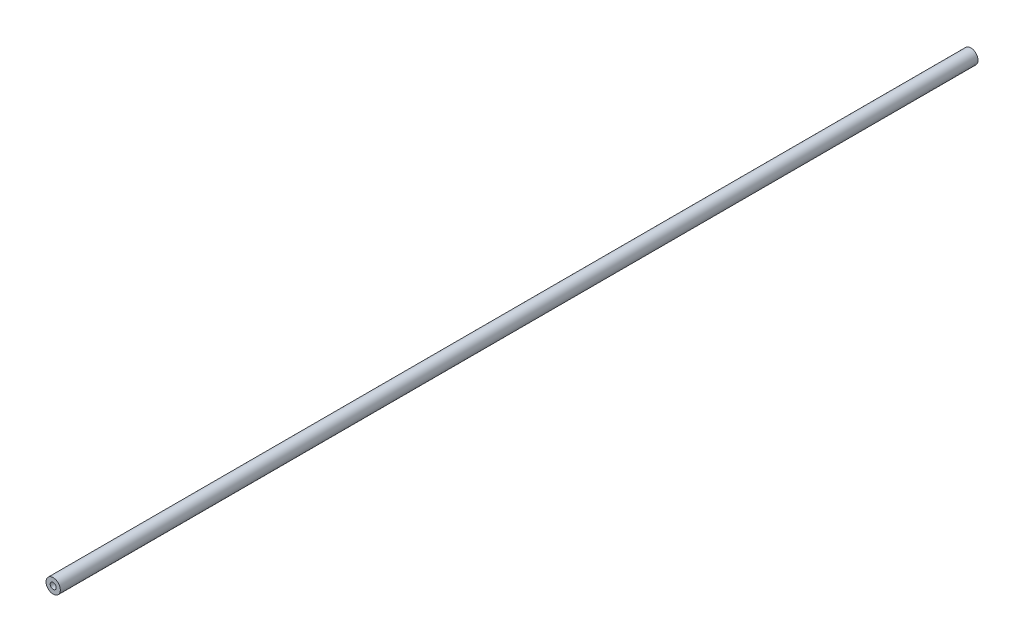
ISO-10303-21;
HEADER;
FILE_DESCRIPTION(('STEP AP214'),'2;1');
FILE_NAME('part.step','',(''),(''),'','','');
FILE_SCHEMA(('AUTOMOTIVE_DESIGN { 1 0 10303 214 1 1 1 1 }'));
ENDSEC;
DATA;
#1=APPLICATION_CONTEXT('core data for automotive mechanical design processes');
#2=APPLICATION_PROTOCOL_DEFINITION('international standard','automotive_design',2000,#1);
#3=PRODUCT_CONTEXT('',#1,'mechanical');
#4=PRODUCT('Part','Part','',(#3));
#5=PRODUCT_RELATED_PRODUCT_CATEGORY('part','',(#4));
#6=PRODUCT_DEFINITION_FORMATION('','',#4);
#7=PRODUCT_DEFINITION_CONTEXT('part definition',#1,'design');
#8=PRODUCT_DEFINITION('design','',#6,#7);
#9=PRODUCT_DEFINITION_SHAPE('','',#8);
#10=(LENGTH_UNIT() NAMED_UNIT(*) SI_UNIT(.MILLI.,.METRE.));
#11=(NAMED_UNIT(*) PLANE_ANGLE_UNIT() SI_UNIT($,.RADIAN.));
#12=(NAMED_UNIT(*) SI_UNIT($,.STERADIAN.) SOLID_ANGLE_UNIT());
#13=UNCERTAINTY_MEASURE_WITH_UNIT(LENGTH_MEASURE(1.E-05),#10,'distance_accuracy_value','');
#14=(GEOMETRIC_REPRESENTATION_CONTEXT(3) GLOBAL_UNCERTAINTY_ASSIGNED_CONTEXT((#13)) GLOBAL_UNIT_ASSIGNED_CONTEXT((#10,
#11,#12)) REPRESENTATION_CONTEXT('',''));
#15=CARTESIAN_POINT('',(0.,0.,0.));
#16=DIRECTION('',(0.,0.,1.));
#17=DIRECTION('',(1.,0.,0.));
#18=AXIS2_PLACEMENT_3D('',#15,#16,#17);
#19=CARTESIAN_POINT('',(0.,0.,304.8));
#20=DIRECTION('',(0.,0.,-1.));
#21=DIRECTION('',(-1.,0.,0.));
#22=AXIS2_PLACEMENT_3D('',#19,#20,#21);
#23=CYLINDRICAL_SURFACE('',#22,4.7625);
#24=CARTESIAN_POINT('',(0.,0.,304.8));
#25=DIRECTION('',(0.,0.,1.));
#26=DIRECTION('',(1.,0.,0.));
#27=AXIS2_PLACEMENT_3D('',#24,#25,#26);
#28=CIRCLE('',#27,4.7625);
#29=CARTESIAN_POINT('',(-4.7625,0.,304.8));
#30=VERTEX_POINT('',#29);
#31=EDGE_CURVE('E11',#30,#30,#28,.T.);
#32=CARTESIAN_POINT('',(0.,0.,-304.8));
#33=DIRECTION('',(0.,0.,1.));
#34=DIRECTION('',(1.,0.,0.));
#35=AXIS2_PLACEMENT_3D('',#32,#33,#34);
#36=CIRCLE('',#35,4.7625);
#37=CARTESIAN_POINT('',(-4.7625,0.,-304.8));
#38=VERTEX_POINT('',#37);
#39=EDGE_CURVE('E49',#38,#38,#36,.T.);
#40=CARTESIAN_POINT('',(-4.7625,0.,304.8));
#41=CARTESIAN_POINT('',(-4.7625,0.,298.45));
#42=CARTESIAN_POINT('',(-4.7625,0.,292.1));
#43=CARTESIAN_POINT('',(-4.7625,0.,279.4));
#44=CARTESIAN_POINT('',(-4.7625,0.,273.05));
#45=CARTESIAN_POINT('',(-4.7625,0.,260.35));
#46=CARTESIAN_POINT('',(-4.7625,0.,254.));
#47=CARTESIAN_POINT('',(-4.7625,0.,241.3));
#48=CARTESIAN_POINT('',(-4.7625,0.,234.95));
#49=CARTESIAN_POINT('',(-4.7625,0.,222.25));
#50=CARTESIAN_POINT('',(-4.7625,0.,215.9));
#51=CARTESIAN_POINT('',(-4.7625,0.,203.2));
#52=CARTESIAN_POINT('',(-4.7625,0.,196.85));
#53=CARTESIAN_POINT('',(-4.7625,0.,184.15));
#54=CARTESIAN_POINT('',(-4.7625,0.,177.8));
#55=CARTESIAN_POINT('',(-4.7625,0.,165.1));
#56=CARTESIAN_POINT('',(-4.7625,0.,158.75));
#57=CARTESIAN_POINT('',(-4.7625,0.,146.05));
#58=CARTESIAN_POINT('',(-4.7625,0.,139.7));
#59=CARTESIAN_POINT('',(-4.7625,0.,127.));
#60=CARTESIAN_POINT('',(-4.7625,0.,120.65));
#61=CARTESIAN_POINT('',(-4.7625,0.,107.95));
#62=CARTESIAN_POINT('',(-4.7625,0.,101.6));
#63=CARTESIAN_POINT('',(-4.7625,0.,88.9));
#64=CARTESIAN_POINT('',(-4.7625,0.,82.55));
#65=CARTESIAN_POINT('',(-4.7625,0.,69.85));
#66=CARTESIAN_POINT('',(-4.7625,0.,63.5));
#67=CARTESIAN_POINT('',(-4.7625,0.,50.8));
#68=CARTESIAN_POINT('',(-4.7625,0.,44.45));
#69=CARTESIAN_POINT('',(-4.7625,0.,31.75));
#70=CARTESIAN_POINT('',(-4.7625,0.,25.4));
#71=CARTESIAN_POINT('',(-4.7625,0.,12.7));
#72=CARTESIAN_POINT('',(-4.7625,0.,6.34999999999995));
#73=CARTESIAN_POINT('',(-4.7625,0.,-6.35000000000006));
#74=CARTESIAN_POINT('',(-4.7625,0.,-12.7000000000001));
#75=CARTESIAN_POINT('',(-4.7625,0.,-25.4000000000001));
#76=CARTESIAN_POINT('',(-4.7625,0.,-31.7500000000001));
#77=CARTESIAN_POINT('',(-4.7625,0.,-44.4500000000001));
#78=CARTESIAN_POINT('',(-4.7625,0.,-50.8000000000001));
#79=CARTESIAN_POINT('',(-4.7625,0.,-63.5000000000001));
#80=CARTESIAN_POINT('',(-4.7625,0.,-69.8500000000001));
#81=CARTESIAN_POINT('',(-4.7625,0.,-82.5500000000001));
#82=CARTESIAN_POINT('',(-4.7625,0.,-88.9000000000001));
#83=CARTESIAN_POINT('',(-4.7625,0.,-101.6));
#84=CARTESIAN_POINT('',(-4.7625,0.,-107.95));
#85=CARTESIAN_POINT('',(-4.7625,0.,-120.65));
#86=CARTESIAN_POINT('',(-4.7625,0.,-127.));
#87=CARTESIAN_POINT('',(-4.7625,0.,-139.7));
#88=CARTESIAN_POINT('',(-4.7625,0.,-146.05));
#89=CARTESIAN_POINT('',(-4.7625,0.,-158.75));
#90=CARTESIAN_POINT('',(-4.7625,0.,-165.1));
#91=CARTESIAN_POINT('',(-4.7625,0.,-177.8));
#92=CARTESIAN_POINT('',(-4.7625,0.,-184.15));
#93=CARTESIAN_POINT('',(-4.7625,0.,-196.85));
#94=CARTESIAN_POINT('',(-4.7625,0.,-203.2));
#95=CARTESIAN_POINT('',(-4.7625,0.,-215.9));
#96=CARTESIAN_POINT('',(-4.7625,0.,-222.25));
#97=CARTESIAN_POINT('',(-4.7625,0.,-234.95));
#98=CARTESIAN_POINT('',(-4.7625,0.,-241.3));
#99=CARTESIAN_POINT('',(-4.7625,0.,-254.));
#100=CARTESIAN_POINT('',(-4.7625,0.,-260.35));
#101=CARTESIAN_POINT('',(-4.7625,0.,-273.05));
#102=CARTESIAN_POINT('',(-4.7625,0.,-279.4));
#103=CARTESIAN_POINT('',(-4.7625,0.,-292.1));
#104=CARTESIAN_POINT('',(-4.7625,0.,-298.45));
#105=CARTESIAN_POINT('',(-4.7625,0.,-304.8));
#106=B_SPLINE_CURVE_WITH_KNOTS('',3,(#40,#41,#42,#43,#44,#45,#46,#47,#48,#49,#50,#51,#52,#53,
#54,#55,#56,#57,#58,#59,#60,#61,#62,#63,#64,#65,#66,#67,#68,#69,#70,#71,#72,#73,#74,#75,#76,#77,
#78,#79,#80,#81,#82,#83,#84,#85,#86,#87,#88,#89,#90,#91,#92,#93,#94,#95,#96,#97,#98,#99,#100,
#101,#102,#103,#104,#105),.UNSPECIFIED.,.F.,.F.,(4,2,2,2,2,2,2,2,2,2,2,2,2,2,2,2,2,2,2,2,2,2,2,
2,2,2,2,2,2,2,2,2,4),(0.,19.05,38.1,57.15,76.2,95.25,114.3,133.35,152.4,171.45,190.5,209.55,
228.6,247.65,266.7,285.75,304.8,323.85,342.9,361.95,381.,400.05,419.1,438.15,457.2,476.25,495.3,
514.35,533.4,552.45,571.5,590.55,609.6),.UNSPECIFIED.);
#107=EDGE_CURVE('BSEAM46',#30,#38,#106,.T.);
#108=ORIENTED_EDGE('',*,*,#31,.F.);
#109=ORIENTED_EDGE('',*,*,#39,.T.);
#110=ORIENTED_EDGE('',*,*,#107,.T.);
#111=ORIENTED_EDGE('',*,*,#107,.F.);
#112=EDGE_LOOP('',(#108,#110,#109,#111));
#113=FACE_BOUND('',#112,.T.);
#114=ADVANCED_FACE('F46',(#113),#23,.T.);
#115=CARTESIAN_POINT('',(0.,0.,304.8));
#116=DIRECTION('',(0.,0.,1.));
#117=DIRECTION('',(1.,0.,0.));
#118=AXIS2_PLACEMENT_3D('',#115,#116,#117);
#119=PLANE('',#118);
#120=CARTESIAN_POINT('',(0.,0.,304.8));
#121=DIRECTION('',(0.,0.,1.));
#122=DIRECTION('',(1.,0.,0.));
#123=AXIS2_PLACEMENT_3D('',#120,#121,#122);
#124=CIRCLE('',#123,2.01929999999999);
#125=CARTESIAN_POINT('',(2.01929999999999,0.,304.8));
#126=VERTEX_POINT('',#125);
#127=EDGE_CURVE('E69',#126,#126,#124,.T.);
#128=ORIENTED_EDGE('',*,*,#127,.F.);
#129=EDGE_LOOP('',(#128));
#130=FACE_BOUND('',#129,.T.);
#131=ORIENTED_EDGE('',*,*,#31,.T.);
#132=EDGE_LOOP('',(#131));
#133=FACE_BOUND('',#132,.T.);
#134=ADVANCED_FACE('F88',(#130,#133),#119,.T.);
#135=CARTESIAN_POINT('',(0.,0.,-304.8));
#136=DIRECTION('',(0.,0.,1.));
#137=DIRECTION('',(1.,0.,0.));
#138=AXIS2_PLACEMENT_3D('',#135,#136,#137);
#139=PLANE('',#138);
#140=CARTESIAN_POINT('',(0.,0.,-304.8));
#141=DIRECTION('',(0.,0.,-1.));
#142=DIRECTION('',(-1.,0.,0.));
#143=AXIS2_PLACEMENT_3D('',#140,#141,#142);
#144=CIRCLE('',#143,2.01929999999999);
#145=CARTESIAN_POINT('',(-2.01929999999999,0.,-304.8));
#146=VERTEX_POINT('',#145);
#147=EDGE_CURVE('E70',#146,#146,#144,.T.);
#148=ORIENTED_EDGE('',*,*,#147,.F.);
#149=EDGE_LOOP('',(#148));
#150=FACE_BOUND('',#149,.T.);
#151=ORIENTED_EDGE('',*,*,#39,.F.);
#152=EDGE_LOOP('',(#151));
#153=FACE_BOUND('',#152,.T.);
#154=ADVANCED_FACE('F85',(#150,#153),#139,.F.);
#155=CARTESIAN_POINT('',(0.,0.,292.77056));
#156=DIRECTION('',(0.,0.,1.));
#157=DIRECTION('',(1.,0.,0.));
#158=AXIS2_PLACEMENT_3D('',#155,#156,#157);
#159=CONICAL_SURFACE('',#158,2.01929999999999,1.02974425867666);
#160=CARTESIAN_POINT('',(0.,0.,291.557242151998));
#161=VERTEX_POINT('',#160);
#162=VERTEX_LOOP('',#161);
#163=FACE_BOUND('',#162,.T.);
#164=CARTESIAN_POINT('',(0.,0.,292.77056));
#165=DIRECTION('',(0.,0.,1.));
#166=DIRECTION('',(1.,0.,0.));
#167=AXIS2_PLACEMENT_3D('',#164,#165,#166);
#168=CIRCLE('',#167,2.01929999999999);
#169=CARTESIAN_POINT('',(2.01929999999999,0.,292.77056));
#170=VERTEX_POINT('',#169);
#171=EDGE_CURVE('E73',#170,#170,#168,.T.);
#172=ORIENTED_EDGE('',*,*,#171,.T.);
#173=EDGE_LOOP('',(#172));
#174=FACE_BOUND('',#173,.T.);
#175=ADVANCED_FACE('F87',(#163,#174),#159,.F.);
#176=CARTESIAN_POINT('',(0.,0.,304.8));
#177=DIRECTION('',(0.,0.,1.));
#178=DIRECTION('',(1.,0.,0.));
#179=AXIS2_PLACEMENT_3D('',#176,#177,#178);
#180=CYLINDRICAL_SURFACE('',#179,2.01929999999999);
#181=ORIENTED_EDGE('',*,*,#171,.F.);
#182=EDGE_LOOP('',(#181));
#183=FACE_BOUND('',#182,.T.);
#184=ORIENTED_EDGE('',*,*,#127,.T.);
#185=EDGE_LOOP('',(#184));
#186=FACE_BOUND('',#185,.T.);
#187=ADVANCED_FACE('F63',(#183,#186),#180,.F.);
#188=CARTESIAN_POINT('',(0.,0.,-292.77056));
#189=DIRECTION('',(0.,0.,-1.));
#190=DIRECTION('',(-1.,0.,0.));
#191=AXIS2_PLACEMENT_3D('',#188,#189,#190);
#192=CONICAL_SURFACE('',#191,2.01929999999999,1.02974425867666);
#193=CARTESIAN_POINT('',(0.,0.,-291.557242151998));
#194=VERTEX_POINT('',#193);
#195=VERTEX_LOOP('',#194);
#196=FACE_BOUND('',#195,.T.);
#197=CARTESIAN_POINT('',(0.,0.,-292.77056));
#198=DIRECTION('',(0.,0.,-1.));
#199=DIRECTION('',(-1.,0.,0.));
#200=AXIS2_PLACEMENT_3D('',#197,#198,#199);
#201=CIRCLE('',#200,2.01929999999999);
#202=CARTESIAN_POINT('',(-2.01929999999999,0.,-292.77056));
#203=VERTEX_POINT('',#202);
#204=EDGE_CURVE('E67',#203,#203,#201,.T.);
#205=ORIENTED_EDGE('',*,*,#204,.T.);
#206=EDGE_LOOP('',(#205));
#207=FACE_BOUND('',#206,.T.);
#208=ADVANCED_FACE('F59',(#196,#207),#192,.F.);
#209=CARTESIAN_POINT('',(0.,0.,-304.8));
#210=DIRECTION('',(0.,0.,-1.));
#211=DIRECTION('',(-1.,0.,0.));
#212=AXIS2_PLACEMENT_3D('',#209,#210,#211);
#213=CYLINDRICAL_SURFACE('',#212,2.01929999999999);
#214=ORIENTED_EDGE('',*,*,#204,.F.);
#215=EDGE_LOOP('',(#214));
#216=FACE_BOUND('',#215,.T.);
#217=ORIENTED_EDGE('',*,*,#147,.T.);
#218=EDGE_LOOP('',(#217));
#219=FACE_BOUND('',#218,.T.);
#220=ADVANCED_FACE('F62',(#216,#219),#213,.F.);
#221=CLOSED_SHELL('',(#114,#134,#154,#175,#187,#208,#220));
#222=MANIFOLD_SOLID_BREP('B2',#221);
#223=ADVANCED_BREP_SHAPE_REPRESENTATION('',(#18,#222),#14);
#224=SHAPE_DEFINITION_REPRESENTATION(#9,#223);
ENDSEC;
END-ISO-10303-21;
